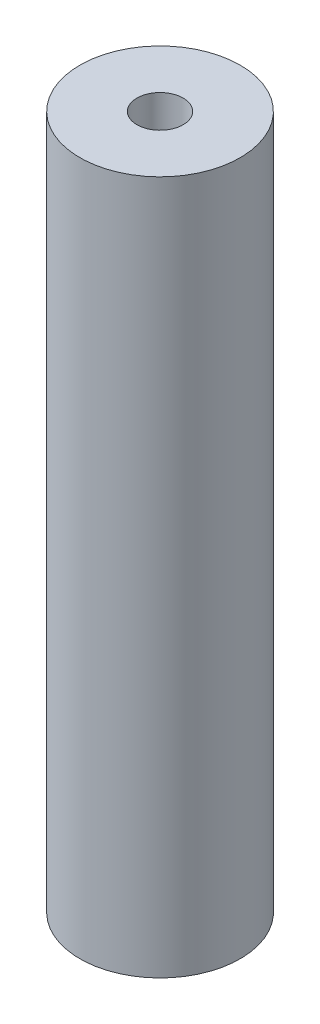
ISO-10303-21;
HEADER;
FILE_DESCRIPTION(('STEP AP214'),'2;1');
FILE_NAME('part.step','',(''),(''),'','','');
FILE_SCHEMA(('AUTOMOTIVE_DESIGN { 1 0 10303 214 1 1 1 1 }'));
ENDSEC;
DATA;
#1=APPLICATION_CONTEXT('core data for automotive mechanical design processes');
#2=APPLICATION_PROTOCOL_DEFINITION('international standard','automotive_design',2000,#1);
#3=PRODUCT_CONTEXT('',#1,'mechanical');
#4=PRODUCT('Part','Part','',(#3));
#5=PRODUCT_RELATED_PRODUCT_CATEGORY('part','',(#4));
#6=PRODUCT_DEFINITION_FORMATION('','',#4);
#7=PRODUCT_DEFINITION_CONTEXT('part definition',#1,'design');
#8=PRODUCT_DEFINITION('design','',#6,#7);
#9=PRODUCT_DEFINITION_SHAPE('','',#8);
#10=(LENGTH_UNIT() NAMED_UNIT(*) SI_UNIT(.MILLI.,.METRE.));
#11=(NAMED_UNIT(*) PLANE_ANGLE_UNIT() SI_UNIT($,.RADIAN.));
#12=(NAMED_UNIT(*) SI_UNIT($,.STERADIAN.) SOLID_ANGLE_UNIT());
#13=UNCERTAINTY_MEASURE_WITH_UNIT(LENGTH_MEASURE(1.E-05),#10,'distance_accuracy_value','');
#14=(GEOMETRIC_REPRESENTATION_CONTEXT(3) GLOBAL_UNCERTAINTY_ASSIGNED_CONTEXT((#13)) GLOBAL_UNIT_ASSIGNED_CONTEXT((#10,
#11,#12)) REPRESENTATION_CONTEXT('',''));
#15=CARTESIAN_POINT('',(0.,0.,0.));
#16=DIRECTION('',(0.,0.,1.));
#17=DIRECTION('',(1.,0.,0.));
#18=AXIS2_PLACEMENT_3D('',#15,#16,#17);
#19=CARTESIAN_POINT('',(0.,45.,0.));
#20=DIRECTION('',(0.,-1.,0.));
#21=DIRECTION('',(0.,0.,-1.));
#22=AXIS2_PLACEMENT_3D('',#19,#20,#21);
#23=CYLINDRICAL_SURFACE('',#22,3.2);
#24=CARTESIAN_POINT('',(0.,41.,0.));
#25=DIRECTION('',(0.,1.,0.));
#26=DIRECTION('',(0.,0.,1.));
#27=AXIS2_PLACEMENT_3D('',#24,#25,#26);
#28=CIRCLE('',#27,3.2);
#29=CARTESIAN_POINT('',(0.,41.,-3.2));
#30=VERTEX_POINT('',#29);
#31=EDGE_CURVE('E38',#30,#30,#28,.T.);
#32=CARTESIAN_POINT('',(0.,4.,0.));
#33=DIRECTION('',(0.,-1.,0.));
#34=DIRECTION('',(0.,0.,-1.));
#35=AXIS2_PLACEMENT_3D('',#32,#33,#34);
#36=CIRCLE('',#35,3.2);
#37=CARTESIAN_POINT('',(0.,4.00000000000001,-3.2));
#38=VERTEX_POINT('',#37);
#39=EDGE_CURVE('E52',#38,#38,#36,.T.);
#40=CARTESIAN_POINT('',(0.,41.,-3.2));
#41=CARTESIAN_POINT('',(0.,40.6145833333333,-3.2));
#42=CARTESIAN_POINT('',(0.,40.2291666666667,-3.2));
#43=CARTESIAN_POINT('',(0.,39.4583333333333,-3.2));
#44=CARTESIAN_POINT('',(0.,39.0729166666667,-3.2));
#45=CARTESIAN_POINT('',(0.,38.3020833333333,-3.2));
#46=CARTESIAN_POINT('',(0.,37.9166666666667,-3.2));
#47=CARTESIAN_POINT('',(0.,37.1458333333333,-3.2));
#48=CARTESIAN_POINT('',(0.,36.7604166666667,-3.2));
#49=CARTESIAN_POINT('',(0.,35.9895833333333,-3.2));
#50=CARTESIAN_POINT('',(0.,35.6041666666667,-3.2));
#51=CARTESIAN_POINT('',(0.,34.8333333333333,-3.2));
#52=CARTESIAN_POINT('',(0.,34.4479166666667,-3.2));
#53=CARTESIAN_POINT('',(0.,33.6770833333333,-3.2));
#54=CARTESIAN_POINT('',(0.,33.2916666666667,-3.2));
#55=CARTESIAN_POINT('',(0.,32.5208333333333,-3.2));
#56=CARTESIAN_POINT('',(0.,32.1354166666667,-3.2));
#57=CARTESIAN_POINT('',(0.,31.3645833333333,-3.2));
#58=CARTESIAN_POINT('',(0.,30.9791666666667,-3.2));
#59=CARTESIAN_POINT('',(0.,30.2083333333333,-3.2));
#60=CARTESIAN_POINT('',(0.,29.8229166666667,-3.2));
#61=CARTESIAN_POINT('',(0.,29.0520833333333,-3.2));
#62=CARTESIAN_POINT('',(0.,28.6666666666667,-3.2));
#63=CARTESIAN_POINT('',(0.,27.8958333333333,-3.2));
#64=CARTESIAN_POINT('',(0.,27.5104166666667,-3.2));
#65=CARTESIAN_POINT('',(0.,26.7395833333333,-3.2));
#66=CARTESIAN_POINT('',(0.,26.3541666666667,-3.2));
#67=CARTESIAN_POINT('',(0.,25.5833333333333,-3.2));
#68=CARTESIAN_POINT('',(0.,25.1979166666667,-3.2));
#69=CARTESIAN_POINT('',(0.,24.4270833333333,-3.2));
#70=CARTESIAN_POINT('',(0.,24.0416666666667,-3.2));
#71=CARTESIAN_POINT('',(0.,23.2708333333333,-3.2));
#72=CARTESIAN_POINT('',(0.,22.8854166666667,-3.2));
#73=CARTESIAN_POINT('',(0.,22.1145833333333,-3.2));
#74=CARTESIAN_POINT('',(0.,21.7291666666667,-3.2));
#75=CARTESIAN_POINT('',(0.,20.9583333333333,-3.2));
#76=CARTESIAN_POINT('',(0.,20.5729166666667,-3.2));
#77=CARTESIAN_POINT('',(0.,19.8020833333333,-3.2));
#78=CARTESIAN_POINT('',(0.,19.4166666666667,-3.2));
#79=CARTESIAN_POINT('',(0.,18.6458333333333,-3.2));
#80=CARTESIAN_POINT('',(0.,18.2604166666667,-3.2));
#81=CARTESIAN_POINT('',(0.,17.4895833333333,-3.2));
#82=CARTESIAN_POINT('',(0.,17.1041666666667,-3.2));
#83=CARTESIAN_POINT('',(0.,16.3333333333333,-3.2));
#84=CARTESIAN_POINT('',(0.,15.9479166666667,-3.2));
#85=CARTESIAN_POINT('',(0.,15.1770833333333,-3.2));
#86=CARTESIAN_POINT('',(0.,14.7916666666667,-3.2));
#87=CARTESIAN_POINT('',(0.,14.0208333333333,-3.2));
#88=CARTESIAN_POINT('',(0.,13.6354166666667,-3.2));
#89=CARTESIAN_POINT('',(0.,12.8645833333333,-3.2));
#90=CARTESIAN_POINT('',(0.,12.4791666666667,-3.2));
#91=CARTESIAN_POINT('',(0.,11.7083333333333,-3.2));
#92=CARTESIAN_POINT('',(0.,11.3229166666667,-3.2));
#93=CARTESIAN_POINT('',(0.,10.5520833333333,-3.2));
#94=CARTESIAN_POINT('',(0.,10.1666666666667,-3.2));
#95=CARTESIAN_POINT('',(0.,9.39583333333334,-3.2));
#96=CARTESIAN_POINT('',(0.,9.01041666666667,-3.2));
#97=CARTESIAN_POINT('',(0.,8.23958333333334,-3.2));
#98=CARTESIAN_POINT('',(0.,7.85416666666668,-3.2));
#99=CARTESIAN_POINT('',(0.,7.08333333333334,-3.2));
#100=CARTESIAN_POINT('',(0.,6.69791666666668,-3.2));
#101=CARTESIAN_POINT('',(0.,5.92708333333334,-3.2));
#102=CARTESIAN_POINT('',(0.,5.54166666666668,-3.2));
#103=CARTESIAN_POINT('',(0.,4.77083333333334,-3.2));
#104=CARTESIAN_POINT('',(0.,4.38541666666668,-3.2));
#105=CARTESIAN_POINT('',(0.,4.00000000000001,-3.2));
#106=B_SPLINE_CURVE_WITH_KNOTS('',3,(#40,#41,#42,#43,#44,#45,#46,#47,#48,#49,#50,#51,#52,#53,
#54,#55,#56,#57,#58,#59,#60,#61,#62,#63,#64,#65,#66,#67,#68,#69,#70,#71,#72,#73,#74,#75,#76,#77,
#78,#79,#80,#81,#82,#83,#84,#85,#86,#87,#88,#89,#90,#91,#92,#93,#94,#95,#96,#97,#98,#99,#100,
#101,#102,#103,#104,#105),.UNSPECIFIED.,.F.,.F.,(4,2,2,2,2,2,2,2,2,2,2,2,2,2,2,2,2,2,2,2,2,2,2,
2,2,2,2,2,2,2,2,2,4),(0.,1.15625,2.3125,3.46875,4.625,5.78124999999999,6.93749999999999,
8.09374999999999,9.24999999999999,10.40625,11.5625,12.71875,13.875,15.03125,16.1875,17.34375,
18.5,19.65625,20.8125,21.96875,23.125,24.28125,25.4375,26.59375,27.75,28.90625,30.0625,31.21875,
32.375,33.53125,34.6875,35.84375,37.),.UNSPECIFIED.);
#107=EDGE_CURVE('BSEAM34',#30,#38,#106,.T.);
#108=ORIENTED_EDGE('',*,*,#31,.T.);
#109=ORIENTED_EDGE('',*,*,#39,.T.);
#110=ORIENTED_EDGE('',*,*,#107,.T.);
#111=ORIENTED_EDGE('',*,*,#107,.F.);
#112=EDGE_LOOP('',(#108,#110,#109,#111));
#113=FACE_BOUND('',#112,.T.);
#114=ADVANCED_FACE('F34',(#113),#23,.F.);
#115=CARTESIAN_POINT('',(0.,45.,0.));
#116=DIRECTION('',(0.,1.,0.));
#117=DIRECTION('',(0.,0.,1.));
#118=AXIS2_PLACEMENT_3D('',#115,#116,#117);
#119=PLANE('',#118);
#120=CARTESIAN_POINT('',(0.,45.,0.));
#121=DIRECTION('',(0.,1.,0.));
#122=DIRECTION('',(0.,0.,1.));
#123=AXIS2_PLACEMENT_3D('',#120,#121,#122);
#124=CIRCLE('',#123,5.2);
#125=CARTESIAN_POINT('',(0.,45.,-5.2));
#126=VERTEX_POINT('',#125);
#127=EDGE_CURVE('E10',#126,#126,#124,.T.);
#128=ORIENTED_EDGE('',*,*,#127,.T.);
#129=EDGE_LOOP('',(#128));
#130=FACE_BOUND('',#129,.T.);
#131=CARTESIAN_POINT('',(0.,45.,0.));
#132=DIRECTION('',(0.,1.,0.));
#133=DIRECTION('',(0.,0.,1.));
#134=AXIS2_PLACEMENT_3D('',#131,#132,#133);
#135=CIRCLE('',#134,1.5);
#136=CARTESIAN_POINT('',(0.,45.,1.5));
#137=VERTEX_POINT('',#136);
#138=EDGE_CURVE('E48',#137,#137,#135,.T.);
#139=ORIENTED_EDGE('',*,*,#138,.F.);
#140=EDGE_LOOP('',(#139));
#141=FACE_BOUND('',#140,.T.);
#142=ADVANCED_FACE('F74',(#130,#141),#119,.T.);
#143=CARTESIAN_POINT('',(0.,0.,0.));
#144=DIRECTION('',(0.,1.,0.));
#145=DIRECTION('',(0.,0.,1.));
#146=AXIS2_PLACEMENT_3D('',#143,#144,#145);
#147=PLANE('',#146);
#148=CARTESIAN_POINT('',(0.,0.,0.));
#149=DIRECTION('',(0.,1.,0.));
#150=DIRECTION('',(0.,0.,1.));
#151=AXIS2_PLACEMENT_3D('',#148,#149,#150);
#152=CIRCLE('',#151,5.2);
#153=CARTESIAN_POINT('',(0.,0.,-5.2));
#154=VERTEX_POINT('',#153);
#155=EDGE_CURVE('E42',#154,#154,#152,.T.);
#156=ORIENTED_EDGE('',*,*,#155,.F.);
#157=EDGE_LOOP('',(#156));
#158=FACE_BOUND('',#157,.T.);
#159=CARTESIAN_POINT('',(0.,0.,0.));
#160=DIRECTION('',(0.,-1.,0.));
#161=DIRECTION('',(0.,0.,-1.));
#162=AXIS2_PLACEMENT_3D('',#159,#160,#161);
#163=CIRCLE('',#162,1.5);
#164=CARTESIAN_POINT('',(0.,0.,-1.5));
#165=VERTEX_POINT('',#164);
#166=EDGE_CURVE('E58',#165,#165,#163,.T.);
#167=ORIENTED_EDGE('',*,*,#166,.F.);
#168=EDGE_LOOP('',(#167));
#169=FACE_BOUND('',#168,.T.);
#170=ADVANCED_FACE('F72',(#158,#169),#147,.F.);
#171=CARTESIAN_POINT('',(0.,45.,0.));
#172=DIRECTION('',(0.,-1.,0.));
#173=DIRECTION('',(0.,0.,-1.));
#174=AXIS2_PLACEMENT_3D('',#171,#172,#173);
#175=CYLINDRICAL_SURFACE('',#174,5.2);
#176=CARTESIAN_POINT('',(0.,0.,-5.2));
#177=CARTESIAN_POINT('',(0.,0.468749999999993,-5.2));
#178=CARTESIAN_POINT('',(0.,0.937499999999992,-5.2));
#179=CARTESIAN_POINT('',(0.,1.87499999999999,-5.2));
#180=CARTESIAN_POINT('',(0.,2.34374999999999,-5.2));
#181=CARTESIAN_POINT('',(0.,3.28124999999999,-5.2));
#182=CARTESIAN_POINT('',(0.,3.74999999999999,-5.2));
#183=CARTESIAN_POINT('',(0.,4.68749999999999,-5.2));
#184=CARTESIAN_POINT('',(0.,5.15624999999999,-5.2));
#185=CARTESIAN_POINT('',(0.,6.09374999999999,-5.2));
#186=CARTESIAN_POINT('',(0.,6.56249999999999,-5.2));
#187=CARTESIAN_POINT('',(0.,7.5,-5.2));
#188=CARTESIAN_POINT('',(0.,7.96874999999999,-5.2));
#189=CARTESIAN_POINT('',(0.,8.90624999999999,-5.2));
#190=CARTESIAN_POINT('',(0.,9.37499999999999,-5.2));
#191=CARTESIAN_POINT('',(0.,10.3125,-5.2));
#192=CARTESIAN_POINT('',(0.,10.78125,-5.2));
#193=CARTESIAN_POINT('',(0.,11.71875,-5.2));
#194=CARTESIAN_POINT('',(0.,12.1875,-5.2));
#195=CARTESIAN_POINT('',(0.,13.125,-5.2));
#196=CARTESIAN_POINT('',(0.,13.59375,-5.2));
#197=CARTESIAN_POINT('',(0.,14.53125,-5.2));
#198=CARTESIAN_POINT('',(0.,15.,-5.2));
#199=CARTESIAN_POINT('',(0.,15.9375,-5.2));
#200=CARTESIAN_POINT('',(0.,16.40625,-5.2));
#201=CARTESIAN_POINT('',(0.,17.34375,-5.2));
#202=CARTESIAN_POINT('',(0.,17.8125,-5.2));
#203=CARTESIAN_POINT('',(0.,18.75,-5.2));
#204=CARTESIAN_POINT('',(0.,19.21875,-5.2));
#205=CARTESIAN_POINT('',(0.,20.15625,-5.2));
#206=CARTESIAN_POINT('',(0.,20.625,-5.2));
#207=CARTESIAN_POINT('',(0.,21.5625,-5.2));
#208=CARTESIAN_POINT('',(0.,22.03125,-5.2));
#209=CARTESIAN_POINT('',(0.,22.96875,-5.2));
#210=CARTESIAN_POINT('',(0.,23.4375,-5.2));
#211=CARTESIAN_POINT('',(0.,24.375,-5.2));
#212=CARTESIAN_POINT('',(0.,24.84375,-5.2));
#213=CARTESIAN_POINT('',(0.,25.78125,-5.2));
#214=CARTESIAN_POINT('',(0.,26.25,-5.2));
#215=CARTESIAN_POINT('',(0.,27.1875,-5.2));
#216=CARTESIAN_POINT('',(0.,27.65625,-5.2));
#217=CARTESIAN_POINT('',(0.,28.59375,-5.2));
#218=CARTESIAN_POINT('',(0.,29.0625,-5.2));
#219=CARTESIAN_POINT('',(0.,30.,-5.2));
#220=CARTESIAN_POINT('',(0.,30.46875,-5.2));
#221=CARTESIAN_POINT('',(0.,31.40625,-5.2));
#222=CARTESIAN_POINT('',(0.,31.875,-5.2));
#223=CARTESIAN_POINT('',(0.,32.8125,-5.2));
#224=CARTESIAN_POINT('',(0.,33.28125,-5.2));
#225=CARTESIAN_POINT('',(0.,34.21875,-5.2));
#226=CARTESIAN_POINT('',(0.,34.6875,-5.2));
#227=CARTESIAN_POINT('',(0.,35.625,-5.2));
#228=CARTESIAN_POINT('',(0.,36.09375,-5.2));
#229=CARTESIAN_POINT('',(0.,37.03125,-5.2));
#230=CARTESIAN_POINT('',(0.,37.5,-5.2));
#231=CARTESIAN_POINT('',(0.,38.4375,-5.2));
#232=CARTESIAN_POINT('',(0.,38.90625,-5.2));
#233=CARTESIAN_POINT('',(0.,39.84375,-5.2));
#234=CARTESIAN_POINT('',(0.,40.3125,-5.2));
#235=CARTESIAN_POINT('',(0.,41.25,-5.2));
#236=CARTESIAN_POINT('',(0.,41.71875,-5.2));
#237=CARTESIAN_POINT('',(0.,42.65625,-5.2));
#238=CARTESIAN_POINT('',(0.,43.125,-5.2));
#239=CARTESIAN_POINT('',(0.,44.0625,-5.2));
#240=CARTESIAN_POINT('',(0.,44.53125,-5.2));
#241=CARTESIAN_POINT('',(0.,45.,-5.2));
#242=B_SPLINE_CURVE_WITH_KNOTS('',3,(#176,#177,#178,#179,#180,#181,#182,#183,#184,#185,#186,
#187,#188,#189,#190,#191,#192,#193,#194,#195,#196,#197,#198,#199,#200,#201,#202,#203,#204,#205,
#206,#207,#208,#209,#210,#211,#212,#213,#214,#215,#216,#217,#218,#219,#220,#221,#222,#223,#224,
#225,#226,#227,#228,#229,#230,#231,#232,#233,#234,#235,#236,#237,#238,#239,#240,#241),
.UNSPECIFIED.,.F.,.F.,(4,2,2,2,2,2,2,2,2,2,2,2,2,2,2,2,2,2,2,2,2,2,2,2,2,2,2,2,2,2,2,2,4),(0.,
1.40625,2.8125,4.21875,5.625,7.03125,8.4375,9.84375,11.25,12.65625,14.0625,15.46875,16.875,
18.28125,19.6875,21.09375,22.5,23.90625,25.3125,26.71875,28.125,29.53125,30.9375,32.34375,33.75,
35.15625,36.5625,37.96875,39.375,40.78125,42.1875,43.59375,45.),.UNSPECIFIED.);
#243=EDGE_CURVE('BSEAM36',#154,#126,#242,.T.);
#244=ORIENTED_EDGE('',*,*,#155,.T.);
#245=ORIENTED_EDGE('',*,*,#127,.F.);
#246=ORIENTED_EDGE('',*,*,#243,.T.);
#247=ORIENTED_EDGE('',*,*,#243,.F.);
#248=EDGE_LOOP('',(#244,#246,#245,#247));
#249=FACE_BOUND('',#248,.T.);
#250=ADVANCED_FACE('F36',(#249),#175,.T.);
#251=CARTESIAN_POINT('',(0.,41.,0.));
#252=DIRECTION('',(0.,1.,0.));
#253=DIRECTION('',(0.,0.,1.));
#254=AXIS2_PLACEMENT_3D('',#251,#252,#253);
#255=PLANE('',#254);
#256=ORIENTED_EDGE('',*,*,#31,.F.);
#257=EDGE_LOOP('',(#256));
#258=FACE_BOUND('',#257,.T.);
#259=CARTESIAN_POINT('',(0.,41.,0.));
#260=DIRECTION('',(0.,1.,0.));
#261=DIRECTION('',(0.,0.,1.));
#262=AXIS2_PLACEMENT_3D('',#259,#260,#261);
#263=CIRCLE('',#262,1.5);
#264=CARTESIAN_POINT('',(0.,41.,1.5));
#265=VERTEX_POINT('',#264);
#266=EDGE_CURVE('E51',#265,#265,#263,.T.);
#267=ORIENTED_EDGE('',*,*,#266,.T.);
#268=EDGE_LOOP('',(#267));
#269=FACE_BOUND('',#268,.T.);
#270=ADVANCED_FACE('F80',(#258,#269),#255,.F.);
#271=CARTESIAN_POINT('',(0.,41.,0.));
#272=DIRECTION('',(0.,1.,0.));
#273=DIRECTION('',(0.,0.,1.));
#274=AXIS2_PLACEMENT_3D('',#271,#272,#273);
#275=CYLINDRICAL_SURFACE('',#274,1.5);
#276=ORIENTED_EDGE('',*,*,#266,.F.);
#277=EDGE_LOOP('',(#276));
#278=FACE_BOUND('',#277,.T.);
#279=ORIENTED_EDGE('',*,*,#138,.T.);
#280=EDGE_LOOP('',(#279));
#281=FACE_BOUND('',#280,.T.);
#282=ADVANCED_FACE('F94',(#278,#281),#275,.F.);
#283=CARTESIAN_POINT('',(0.,4.,0.));
#284=DIRECTION('',(0.,-1.,0.));
#285=DIRECTION('',(0.,0.,-1.));
#286=AXIS2_PLACEMENT_3D('',#283,#284,#285);
#287=PLANE('',#286);
#288=ORIENTED_EDGE('',*,*,#39,.F.);
#289=EDGE_LOOP('',(#288));
#290=FACE_BOUND('',#289,.T.);
#291=CARTESIAN_POINT('',(0.,4.,0.));
#292=DIRECTION('',(0.,-1.,0.));
#293=DIRECTION('',(0.,0.,-1.));
#294=AXIS2_PLACEMENT_3D('',#291,#292,#293);
#295=CIRCLE('',#294,1.5);
#296=CARTESIAN_POINT('',(0.,4.,-1.5));
#297=VERTEX_POINT('',#296);
#298=EDGE_CURVE('E57',#297,#297,#295,.T.);
#299=ORIENTED_EDGE('',*,*,#298,.T.);
#300=EDGE_LOOP('',(#299));
#301=FACE_BOUND('',#300,.T.);
#302=ADVANCED_FACE('F64',(#290,#301),#287,.F.);
#303=CARTESIAN_POINT('',(0.,4.,0.));
#304=DIRECTION('',(0.,-1.,0.));
#305=DIRECTION('',(0.,0.,-1.));
#306=AXIS2_PLACEMENT_3D('',#303,#304,#305);
#307=CYLINDRICAL_SURFACE('',#306,1.5);
#308=ORIENTED_EDGE('',*,*,#298,.F.);
#309=EDGE_LOOP('',(#308));
#310=FACE_BOUND('',#309,.T.);
#311=ORIENTED_EDGE('',*,*,#166,.T.);
#312=EDGE_LOOP('',(#311));
#313=FACE_BOUND('',#312,.T.);
#314=ADVANCED_FACE('F66',(#310,#313),#307,.F.);
#315=CLOSED_SHELL('',(#114,#142,#170,#250,#270,#282,#302,#314));
#316=MANIFOLD_SOLID_BREP('B2',#315);
#317=ADVANCED_BREP_SHAPE_REPRESENTATION('',(#18,#316),#14);
#318=SHAPE_DEFINITION_REPRESENTATION(#9,#317);
ENDSEC;
END-ISO-10303-21;
